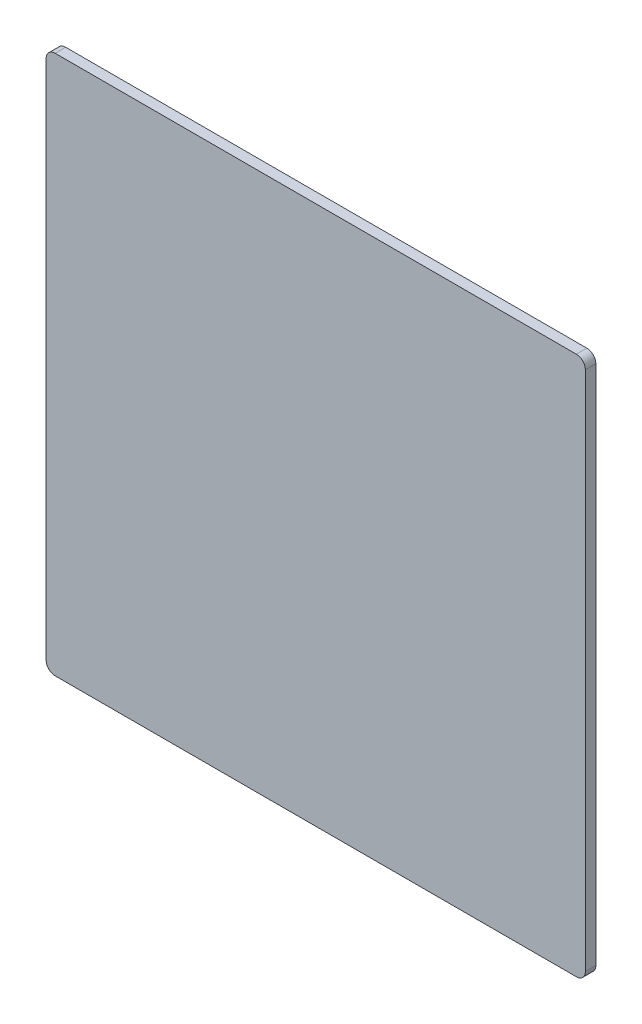
ISO-10303-21;
HEADER;
FILE_DESCRIPTION(('STEP AP214'),'2;1');
FILE_NAME('part.step','',(''),(''),'','','');
FILE_SCHEMA(('AUTOMOTIVE_DESIGN { 1 0 10303 214 1 1 1 1 }'));
ENDSEC;
DATA;
#1=APPLICATION_CONTEXT('core data for automotive mechanical design processes');
#2=APPLICATION_PROTOCOL_DEFINITION('international standard','automotive_design',2000,#1);
#3=PRODUCT_CONTEXT('',#1,'mechanical');
#4=PRODUCT('Part','Part','',(#3));
#5=PRODUCT_RELATED_PRODUCT_CATEGORY('part','',(#4));
#6=PRODUCT_DEFINITION_FORMATION('','',#4);
#7=PRODUCT_DEFINITION_CONTEXT('part definition',#1,'design');
#8=PRODUCT_DEFINITION('design','',#6,#7);
#9=PRODUCT_DEFINITION_SHAPE('','',#8);
#10=(LENGTH_UNIT() NAMED_UNIT(*) SI_UNIT(.MILLI.,.METRE.));
#11=(NAMED_UNIT(*) PLANE_ANGLE_UNIT() SI_UNIT($,.RADIAN.));
#12=(NAMED_UNIT(*) SI_UNIT($,.STERADIAN.) SOLID_ANGLE_UNIT());
#13=UNCERTAINTY_MEASURE_WITH_UNIT(LENGTH_MEASURE(1.E-05),#10,'distance_accuracy_value','');
#14=(GEOMETRIC_REPRESENTATION_CONTEXT(3) GLOBAL_UNCERTAINTY_ASSIGNED_CONTEXT((#13)) GLOBAL_UNIT_ASSIGNED_CONTEXT((#10,
#11,#12)) REPRESENTATION_CONTEXT('',''));
#15=CARTESIAN_POINT('',(0.,0.,0.));
#16=DIRECTION('',(0.,0.,1.));
#17=DIRECTION('',(1.,0.,0.));
#18=AXIS2_PLACEMENT_3D('',#15,#16,#17);
#19=CARTESIAN_POINT('',(65.,-65.,-19.95999956131));
#20=DIRECTION('',(0.,0.,-1.));
#21=DIRECTION('',(0.,-1.,0.));
#22=AXIS2_PLACEMENT_3D('',#19,#20,#21);
#23=PLANE('',#22);
#24=CARTESIAN_POINT('',(65.,-65.,-19.95999956131));
#25=DIRECTION('',(0.,0.,-1.));
#26=DIRECTION('',(1.,0.,0.));
#27=AXIS2_PLACEMENT_3D('',#24,#25,#26);
#28=CIRCLE('',#27,1.5);
#29=CARTESIAN_POINT('',(66.5,-65.,-19.95999956131));
#30=VERTEX_POINT('',#29);
#31=EDGE_CURVE('P0_E9',#30,#30,#28,.T.);
#32=ORIENTED_EDGE('',*,*,#31,.F.);
#33=EDGE_LOOP('',(#32));
#34=FACE_BOUND('',#33,.T.);
#35=ADVANCED_FACE('P0_F14',(#34),#23,.F.);
#36=CARTESIAN_POINT('',(65.,-65.,-20.));
#37=DIRECTION('',(0.,0.,1.));
#38=DIRECTION('',(1.,0.,0.));
#39=AXIS2_PLACEMENT_3D('',#36,#37,#38);
#40=PLANE('',#39);
#41=CARTESIAN_POINT('',(65.,-65.,-20.));
#42=DIRECTION('',(0.,0.,1.));
#43=DIRECTION('',(1.,0.,0.));
#44=AXIS2_PLACEMENT_3D('',#41,#42,#43);
#45=CIRCLE('',#44,1.5);
#46=CARTESIAN_POINT('',(66.5,-65.,-20.));
#47=VERTEX_POINT('',#46);
#48=EDGE_CURVE('P0_E21',#47,#47,#45,.T.);
#49=ORIENTED_EDGE('',*,*,#48,.F.);
#50=EDGE_LOOP('',(#49));
#51=FACE_BOUND('',#50,.T.);
#52=ADVANCED_FACE('P0_F36',(#51),#40,.F.);
#53=CARTESIAN_POINT('',(65.,-65.,-20.));
#54=DIRECTION('',(0.,0.,1.));
#55=DIRECTION('',(1.,0.,0.));
#56=AXIS2_PLACEMENT_3D('',#53,#54,#55);
#57=CYLINDRICAL_SURFACE('',#56,1.5);
#58=ORIENTED_EDGE('',*,*,#31,.T.);
#59=EDGE_LOOP('',(#58));
#60=FACE_BOUND('',#59,.T.);
#61=ORIENTED_EDGE('',*,*,#48,.T.);
#62=EDGE_LOOP('',(#61));
#63=FACE_BOUND('',#62,.T.);
#64=ADVANCED_FACE('P0_F34',(#60,#63),#57,.T.);
#65=CLOSED_SHELL('',(#35,#52,#64));
#66=MANIFOLD_SOLID_BREP('P0_B1',#65);
#67=CARTESIAN_POINT('',(-87.,87.,3.4999999999998));
#68=DIRECTION('',(0.,0.,-1.));
#69=DIRECTION('',(-1.,0.,0.));
#70=AXIS2_PLACEMENT_3D('',#67,#68,#69);
#71=CYLINDRICAL_SURFACE('',#70,3.);
#72=CARTESIAN_POINT('',(-87.,87.,3.50000000000019));
#73=DIRECTION('',(0.,0.,1.));
#74=DIRECTION('',(0.,1.,0.));
#75=AXIS2_PLACEMENT_3D('',#72,#73,#74);
#76=CIRCLE('',#75,3.);
#77=CARTESIAN_POINT('',(-87.,90.,3.5000000000002));
#78=VERTEX_POINT('',#77);
#79=CARTESIAN_POINT('',(-90.,87.,3.50000000000019));
#80=VERTEX_POINT('',#79);
#81=EDGE_CURVE('P1_E110',#78,#80,#76,.T.);
#82=ORIENTED_EDGE('',*,*,#81,.F.);
#83=DIRECTION('',(0.,0.,1.));
#84=VECTOR('',#83,1.);
#85=CARTESIAN_POINT('',(-87.,90.,3.5000000000002));
#86=LINE('',#85,#84);
#87=CARTESIAN_POINT('',(-87.,90.,1.99147411979029E-13));
#88=VERTEX_POINT('',#87);
#89=EDGE_CURVE('P1_E139',#88,#78,#86,.T.);
#90=ORIENTED_EDGE('',*,*,#89,.F.);
#91=CARTESIAN_POINT('',(-87.,87.,1.92554305833426E-13));
#92=DIRECTION('',(0.,0.,-1.));
#93=DIRECTION('',(0.,1.,0.));
#94=AXIS2_PLACEMENT_3D('',#91,#92,#93);
#95=CIRCLE('',#94,3.);
#96=CARTESIAN_POINT('',(-90.,87.,1.92509164913062E-13));
#97=VERTEX_POINT('',#96);
#98=EDGE_CURVE('P1_E180',#97,#88,#95,.T.);
#99=ORIENTED_EDGE('',*,*,#98,.F.);
#100=DIRECTION('',(0.,0.,-1.));
#101=VECTOR('',#100,1.);
#102=CARTESIAN_POINT('',(-90.,87.,3.4999999999998));
#103=LINE('',#102,#101);
#104=EDGE_CURVE('P1_E141',#80,#97,#103,.T.);
#105=ORIENTED_EDGE('',*,*,#104,.F.);
#106=EDGE_LOOP('',(#82,#90,#99,#105));
#107=FACE_BOUND('',#106,.T.);
#108=ADVANCED_FACE('P1_F16',(#107),#71,.T.);
#109=CARTESIAN_POINT('',(87.,87.,3.5000000000002));
#110=DIRECTION('',(0.,0.,-1.));
#111=DIRECTION('',(-1.,0.,0.));
#112=AXIS2_PLACEMENT_3D('',#109,#110,#111);
#113=CYLINDRICAL_SURFACE('',#112,3.);
#114=CARTESIAN_POINT('',(87.,87.,3.50000000000019));
#115=DIRECTION('',(0.,0.,1.));
#116=DIRECTION('',(0.,1.,0.));
#117=AXIS2_PLACEMENT_3D('',#114,#115,#116);
#118=CIRCLE('',#117,3.);
#119=CARTESIAN_POINT('',(90.,87.,3.50000000000019));
#120=VERTEX_POINT('',#119);
#121=CARTESIAN_POINT('',(87.,90.,3.5000000000002));
#122=VERTEX_POINT('',#121);
#123=EDGE_CURVE('P1_E117',#120,#122,#118,.T.);
#124=ORIENTED_EDGE('',*,*,#123,.F.);
#125=DIRECTION('',(0.,0.,1.));
#126=VECTOR('',#125,1.);
#127=CARTESIAN_POINT('',(90.,87.,3.5000000000002));
#128=LINE('',#127,#126);
#129=CARTESIAN_POINT('',(90.,87.,1.92509164913061E-13));
#130=VERTEX_POINT('',#129);
#131=EDGE_CURVE('P1_E162',#130,#120,#128,.T.);
#132=ORIENTED_EDGE('',*,*,#131,.F.);
#133=CARTESIAN_POINT('',(87.,87.,1.92554305833426E-13));
#134=DIRECTION('',(0.,0.,-1.));
#135=DIRECTION('',(0.,1.,0.));
#136=AXIS2_PLACEMENT_3D('',#133,#134,#135);
#137=CIRCLE('',#136,3.);
#138=CARTESIAN_POINT('',(87.,90.,1.99147411979029E-13));
#139=VERTEX_POINT('',#138);
#140=EDGE_CURVE('P1_E25',#139,#130,#137,.T.);
#141=ORIENTED_EDGE('',*,*,#140,.F.);
#142=DIRECTION('',(0.,0.,-1.));
#143=VECTOR('',#142,1.);
#144=CARTESIAN_POINT('',(87.,90.,3.5000000000002));
#145=LINE('',#144,#143);
#146=EDGE_CURVE('P1_E130',#122,#139,#145,.T.);
#147=ORIENTED_EDGE('',*,*,#146,.F.);
#148=EDGE_LOOP('',(#124,#132,#141,#147));
#149=FACE_BOUND('',#148,.T.);
#150=ADVANCED_FACE('P1_F131',(#149),#113,.T.);
#151=CARTESIAN_POINT('',(87.,-87.,3.5000000000002));
#152=DIRECTION('',(0.,0.,-1.));
#153=DIRECTION('',(-1.,0.,0.));
#154=AXIS2_PLACEMENT_3D('',#151,#152,#153);
#155=CYLINDRICAL_SURFACE('',#154,3.);
#156=CARTESIAN_POINT('',(87.,-87.,3.49999999999981));
#157=DIRECTION('',(0.,0.,1.));
#158=DIRECTION('',(0.,1.,0.));
#159=AXIS2_PLACEMENT_3D('',#156,#157,#158);
#160=CIRCLE('',#159,3.);
#161=CARTESIAN_POINT('',(87.,-90.,3.4999999999998));
#162=VERTEX_POINT('',#161);
#163=CARTESIAN_POINT('',(90.,-87.,3.49999999999981));
#164=VERTEX_POINT('',#163);
#165=EDGE_CURVE('P1_E73',#162,#164,#160,.T.);
#166=ORIENTED_EDGE('',*,*,#165,.F.);
#167=DIRECTION('',(0.,0.,1.));
#168=VECTOR('',#167,1.);
#169=CARTESIAN_POINT('',(87.,-90.,3.4999999999998));
#170=LINE('',#169,#168);
#171=CARTESIAN_POINT('',(87.,-90.,-1.99147411979029E-13));
#172=VERTEX_POINT('',#171);
#173=EDGE_CURVE('P1_E179',#172,#162,#170,.T.);
#174=ORIENTED_EDGE('',*,*,#173,.F.);
#175=CARTESIAN_POINT('',(87.,-87.,-1.92554305833426E-13));
#176=DIRECTION('',(0.,0.,-1.));
#177=DIRECTION('',(0.,1.,0.));
#178=AXIS2_PLACEMENT_3D('',#175,#176,#177);
#179=CIRCLE('',#178,3.);
#180=CARTESIAN_POINT('',(90.,-87.,-1.92509164913062E-13));
#181=VERTEX_POINT('',#180);
#182=EDGE_CURVE('P1_E10',#181,#172,#179,.T.);
#183=ORIENTED_EDGE('',*,*,#182,.F.);
#184=DIRECTION('',(0.,0.,-1.));
#185=VECTOR('',#184,1.);
#186=CARTESIAN_POINT('',(90.,-87.,3.5000000000002));
#187=LINE('',#186,#185);
#188=EDGE_CURVE('P1_E158',#164,#181,#187,.T.);
#189=ORIENTED_EDGE('',*,*,#188,.F.);
#190=EDGE_LOOP('',(#166,#174,#183,#189));
#191=FACE_BOUND('',#190,.T.);
#192=ADVANCED_FACE('P1_F200',(#191),#155,.T.);
#193=CARTESIAN_POINT('',(-87.,-87.,3.4999999999998));
#194=DIRECTION('',(0.,0.,-1.));
#195=DIRECTION('',(-1.,0.,0.));
#196=AXIS2_PLACEMENT_3D('',#193,#194,#195);
#197=CYLINDRICAL_SURFACE('',#196,3.);
#198=CARTESIAN_POINT('',(-87.,-87.,3.49999999999981));
#199=DIRECTION('',(0.,0.,1.));
#200=DIRECTION('',(0.,1.,0.));
#201=AXIS2_PLACEMENT_3D('',#198,#199,#200);
#202=CIRCLE('',#201,3.);
#203=CARTESIAN_POINT('',(-90.,-87.,3.49999999999981));
#204=VERTEX_POINT('',#203);
#205=CARTESIAN_POINT('',(-87.,-90.,3.4999999999998));
#206=VERTEX_POINT('',#205);
#207=EDGE_CURVE('P1_E86',#204,#206,#202,.T.);
#208=ORIENTED_EDGE('',*,*,#207,.F.);
#209=DIRECTION('',(0.,0.,1.));
#210=VECTOR('',#209,1.);
#211=CARTESIAN_POINT('',(-90.,-87.,3.4999999999998));
#212=LINE('',#211,#210);
#213=CARTESIAN_POINT('',(-90.,-87.,-1.92509164913061E-13));
#214=VERTEX_POINT('',#213);
#215=EDGE_CURVE('P1_E210',#214,#204,#212,.T.);
#216=ORIENTED_EDGE('',*,*,#215,.F.);
#217=CARTESIAN_POINT('',(-87.,-87.,-1.92554305833426E-13));
#218=DIRECTION('',(0.,0.,-1.));
#219=DIRECTION('',(0.,1.,0.));
#220=AXIS2_PLACEMENT_3D('',#217,#218,#219);
#221=CIRCLE('',#220,3.);
#222=CARTESIAN_POINT('',(-87.,-90.,-1.99147411979029E-13));
#223=VERTEX_POINT('',#222);
#224=EDGE_CURVE('P1_E183',#223,#214,#221,.T.);
#225=ORIENTED_EDGE('',*,*,#224,.F.);
#226=DIRECTION('',(0.,0.,-1.));
#227=VECTOR('',#226,1.);
#228=CARTESIAN_POINT('',(-87.,-90.,3.4999999999998));
#229=LINE('',#228,#227);
#230=EDGE_CURVE('P1_E172',#206,#223,#229,.T.);
#231=ORIENTED_EDGE('',*,*,#230,.F.);
#232=EDGE_LOOP('',(#208,#216,#225,#231));
#233=FACE_BOUND('',#232,.T.);
#234=ADVANCED_FACE('P1_F211',(#233),#197,.T.);
#235=CARTESIAN_POINT('',(-65.,-65.,-20.));
#236=DIRECTION('',(0.,0.,1.));
#237=DIRECTION('',(1.,0.,0.));
#238=AXIS2_PLACEMENT_3D('',#235,#236,#237);
#239=PLANE('',#238);
#240=CARTESIAN_POINT('',(-65.,-65.,-20.));
#241=DIRECTION('',(0.,0.,1.));
#242=DIRECTION('',(1.,0.,0.));
#243=AXIS2_PLACEMENT_3D('',#240,#241,#242);
#244=CIRCLE('',#243,1.5);
#245=CARTESIAN_POINT('',(-63.5,-65.,-20.));
#246=VERTEX_POINT('',#245);
#247=EDGE_CURVE('P1_E424',#246,#246,#244,.T.);
#248=ORIENTED_EDGE('',*,*,#247,.F.);
#249=EDGE_LOOP('',(#248));
#250=FACE_BOUND('',#249,.T.);
#251=ADVANCED_FACE('P1_F253',(#250),#239,.F.);
#252=CARTESIAN_POINT('',(-65.,65.,-20.));
#253=DIRECTION('',(0.,0.,1.));
#254=DIRECTION('',(1.,0.,0.));
#255=AXIS2_PLACEMENT_3D('',#252,#253,#254);
#256=PLANE('',#255);
#257=CARTESIAN_POINT('',(-65.,65.,-20.));
#258=DIRECTION('',(0.,0.,1.));
#259=DIRECTION('',(1.,0.,0.));
#260=AXIS2_PLACEMENT_3D('',#257,#258,#259);
#261=CIRCLE('',#260,1.5);
#262=CARTESIAN_POINT('',(-63.5,65.,-20.));
#263=VERTEX_POINT('',#262);
#264=EDGE_CURVE('P1_E409',#263,#263,#261,.T.);
#265=ORIENTED_EDGE('',*,*,#264,.F.);
#266=EDGE_LOOP('',(#265));
#267=FACE_BOUND('',#266,.T.);
#268=ADVANCED_FACE('P1_F251',(#267),#256,.F.);
#269=CARTESIAN_POINT('',(65.,65.,-20.));
#270=DIRECTION('',(0.,0.,1.));
#271=DIRECTION('',(1.,0.,0.));
#272=AXIS2_PLACEMENT_3D('',#269,#270,#271);
#273=PLANE('',#272);
#274=CARTESIAN_POINT('',(65.,65.,-20.));
#275=DIRECTION('',(0.,0.,1.));
#276=DIRECTION('',(1.,0.,0.));
#277=AXIS2_PLACEMENT_3D('',#274,#275,#276);
#278=CIRCLE('',#277,1.5);
#279=CARTESIAN_POINT('',(66.5,65.,-20.));
#280=VERTEX_POINT('',#279);
#281=EDGE_CURVE('P1_E229',#280,#280,#278,.T.);
#282=ORIENTED_EDGE('',*,*,#281,.F.);
#283=EDGE_LOOP('',(#282));
#284=FACE_BOUND('',#283,.T.);
#285=ADVANCED_FACE('P1_F277',(#284),#273,.F.);
#286=CARTESIAN_POINT('',(0.,0.,0.));
#287=DIRECTION('',(0.,0.,-1.));
#288=DIRECTION('',(-1.,0.,0.));
#289=AXIS2_PLACEMENT_3D('',#286,#287,#288);
#290=PLANE('',#289);
#291=CARTESIAN_POINT('',(-65.,-65.,-1.42247325030098E-13));
#292=DIRECTION('',(0.,0.,-1.));
#293=DIRECTION('',(0.,1.,0.));
#294=AXIS2_PLACEMENT_3D('',#291,#292,#293);
#295=CIRCLE('',#294,1.5);
#296=CARTESIAN_POINT('',(-65.,-63.5,-1.38928201497114E-13));
#297=VERTEX_POINT('',#296);
#298=EDGE_CURVE('P1_E416',#297,#297,#295,.T.);
#299=ORIENTED_EDGE('',*,*,#298,.F.);
#300=EDGE_LOOP('',(#299));
#301=FACE_BOUND('',#300,.T.);
#302=CARTESIAN_POINT('',(-65.,65.,1.42247325030098E-13));
#303=DIRECTION('',(0.,0.,-1.));
#304=DIRECTION('',(0.,1.,0.));
#305=AXIS2_PLACEMENT_3D('',#302,#303,#304);
#306=CIRCLE('',#305,1.5);
#307=CARTESIAN_POINT('',(-65.,66.5,1.45566448563082E-13));
#308=VERTEX_POINT('',#307);
#309=EDGE_CURVE('P1_E234',#308,#308,#306,.T.);
#310=ORIENTED_EDGE('',*,*,#309,.F.);
#311=EDGE_LOOP('',(#310));
#312=FACE_BOUND('',#311,.T.);
#313=CARTESIAN_POINT('',(65.,-65.,-1.42247325030098E-13));
#314=DIRECTION('',(0.,0.,-1.));
#315=DIRECTION('',(0.,1.,0.));
#316=AXIS2_PLACEMENT_3D('',#313,#314,#315);
#317=CIRCLE('',#316,1.5);
#318=CARTESIAN_POINT('',(65.,-63.5,-1.38928201497114E-13));
#319=VERTEX_POINT('',#318);
#320=EDGE_CURVE('P1_E218',#319,#319,#317,.T.);
#321=ORIENTED_EDGE('',*,*,#320,.F.);
#322=EDGE_LOOP('',(#321));
#323=FACE_BOUND('',#322,.T.);
#324=CARTESIAN_POINT('',(65.,65.,0.));
#325=DIRECTION('',(0.,0.,1.));
#326=DIRECTION('',(1.,0.,0.));
#327=AXIS2_PLACEMENT_3D('',#324,#325,#326);
#328=CIRCLE('',#327,1.5);
#329=CARTESIAN_POINT('',(66.5,65.,0.));
#330=VERTEX_POINT('',#329);
#331=EDGE_CURVE('P1_E233',#330,#330,#328,.T.);
#332=ORIENTED_EDGE('',*,*,#331,.T.);
#333=EDGE_LOOP('',(#332));
#334=FACE_BOUND('',#333,.T.);
#335=DIRECTION('',(-1.,0.,0.));
#336=VECTOR('',#335,1.);
#337=CARTESIAN_POINT('',(90.,-90.,-1.99147411979029E-13));
#338=LINE('',#337,#336);
#339=EDGE_CURVE('P1_E176',#172,#223,#338,.T.);
#340=ORIENTED_EDGE('',*,*,#339,.T.);
#341=ORIENTED_EDGE('',*,*,#224,.T.);
#342=DIRECTION('',(0.,1.,0.));
#343=VECTOR('',#342,1.);
#344=CARTESIAN_POINT('',(-90.,-90.,-1.99147411979029E-13));
#345=LINE('',#344,#343);
#346=EDGE_CURVE('P1_E207',#214,#97,#345,.T.);
#347=ORIENTED_EDGE('',*,*,#346,.T.);
#348=ORIENTED_EDGE('',*,*,#98,.T.);
#349=DIRECTION('',(1.,0.,0.));
#350=VECTOR('',#349,1.);
#351=CARTESIAN_POINT('',(-90.,90.,1.99147411979029E-13));
#352=LINE('',#351,#350);
#353=EDGE_CURVE('P1_E136',#88,#139,#352,.T.);
#354=ORIENTED_EDGE('',*,*,#353,.T.);
#355=ORIENTED_EDGE('',*,*,#140,.T.);
#356=DIRECTION('',(0.,-1.,0.));
#357=VECTOR('',#356,1.);
#358=CARTESIAN_POINT('',(90.,90.,1.99147411979029E-13));
#359=LINE('',#358,#357);
#360=EDGE_CURVE('P1_E159',#130,#181,#359,.T.);
#361=ORIENTED_EDGE('',*,*,#360,.T.);
#362=ORIENTED_EDGE('',*,*,#182,.T.);
#363=EDGE_LOOP('',(#340,#341,#347,#348,#354,#355,#361,#362));
#364=FACE_BOUND('',#363,.T.);
#365=ADVANCED_FACE('P1_F196',(#301,#312,#323,#334,#364),#290,.T.);
#366=CARTESIAN_POINT('',(0.,0.,3.5));
#367=DIRECTION('',(0.,0.,-1.));
#368=DIRECTION('',(-1.,0.,0.));
#369=AXIS2_PLACEMENT_3D('',#366,#367,#368);
#370=PLANE('',#369);
#371=DIRECTION('',(0.,1.,0.));
#372=VECTOR('',#371,1.);
#373=CARTESIAN_POINT('',(-90.,-90.,3.4999999999998));
#374=LINE('',#373,#372);
#375=EDGE_CURVE('P1_E148',#204,#80,#374,.T.);
#376=ORIENTED_EDGE('',*,*,#375,.F.);
#377=ORIENTED_EDGE('',*,*,#207,.T.);
#378=DIRECTION('',(-1.,0.,0.));
#379=VECTOR('',#378,1.);
#380=CARTESIAN_POINT('',(90.,-90.,3.4999999999998));
#381=LINE('',#380,#379);
#382=EDGE_CURVE('P1_E168',#162,#206,#381,.T.);
#383=ORIENTED_EDGE('',*,*,#382,.F.);
#384=ORIENTED_EDGE('',*,*,#165,.T.);
#385=DIRECTION('',(0.,-1.,0.));
#386=VECTOR('',#385,1.);
#387=CARTESIAN_POINT('',(90.,90.,3.5000000000002));
#388=LINE('',#387,#386);
#389=EDGE_CURVE('P1_E123',#120,#164,#388,.T.);
#390=ORIENTED_EDGE('',*,*,#389,.F.);
#391=ORIENTED_EDGE('',*,*,#123,.T.);
#392=DIRECTION('',(1.,0.,0.));
#393=VECTOR('',#392,1.);
#394=CARTESIAN_POINT('',(-90.,90.,3.5000000000002));
#395=LINE('',#394,#393);
#396=EDGE_CURVE('P1_E121',#78,#122,#395,.T.);
#397=ORIENTED_EDGE('',*,*,#396,.F.);
#398=ORIENTED_EDGE('',*,*,#81,.T.);
#399=EDGE_LOOP('',(#376,#377,#383,#384,#390,#391,#397,#398));
#400=FACE_BOUND('',#399,.T.);
#401=ADVANCED_FACE('P1_F119',(#400),#370,.F.);
#402=CARTESIAN_POINT('',(90.,-90.,3.4999999999998));
#403=DIRECTION('',(0.,-1.,0.));
#404=DIRECTION('',(0.,0.,-1.));
#405=AXIS2_PLACEMENT_3D('',#402,#403,#404);
#406=PLANE('',#405);
#407=ORIENTED_EDGE('',*,*,#382,.T.);
#408=ORIENTED_EDGE('',*,*,#230,.T.);
#409=ORIENTED_EDGE('',*,*,#339,.F.);
#410=ORIENTED_EDGE('',*,*,#173,.T.);
#411=EDGE_LOOP('',(#407,#408,#409,#410));
#412=FACE_BOUND('',#411,.T.);
#413=ADVANCED_FACE('P1_F203',(#412),#406,.T.);
#414=CARTESIAN_POINT('',(90.,90.,3.5000000000002));
#415=DIRECTION('',(1.,0.,0.));
#416=DIRECTION('',(0.,1.,0.));
#417=AXIS2_PLACEMENT_3D('',#414,#415,#416);
#418=PLANE('',#417);
#419=ORIENTED_EDGE('',*,*,#389,.T.);
#420=ORIENTED_EDGE('',*,*,#188,.T.);
#421=ORIENTED_EDGE('',*,*,#360,.F.);
#422=ORIENTED_EDGE('',*,*,#131,.T.);
#423=EDGE_LOOP('',(#419,#420,#421,#422));
#424=FACE_BOUND('',#423,.T.);
#425=ADVANCED_FACE('P1_F199',(#424),#418,.T.);
#426=CARTESIAN_POINT('',(-90.,90.,3.5000000000002));
#427=DIRECTION('',(0.,1.,0.));
#428=DIRECTION('',(1.,0.,0.));
#429=AXIS2_PLACEMENT_3D('',#426,#427,#428);
#430=PLANE('',#429);
#431=ORIENTED_EDGE('',*,*,#396,.T.);
#432=ORIENTED_EDGE('',*,*,#146,.T.);
#433=ORIENTED_EDGE('',*,*,#353,.F.);
#434=ORIENTED_EDGE('',*,*,#89,.T.);
#435=EDGE_LOOP('',(#431,#432,#433,#434));
#436=FACE_BOUND('',#435,.T.);
#437=ADVANCED_FACE('P1_F138',(#436),#430,.T.);
#438=CARTESIAN_POINT('',(-90.,-90.,3.4999999999998));
#439=DIRECTION('',(-1.,0.,0.));
#440=DIRECTION('',(0.,0.,1.));
#441=AXIS2_PLACEMENT_3D('',#438,#439,#440);
#442=PLANE('',#441);
#443=ORIENTED_EDGE('',*,*,#346,.F.);
#444=ORIENTED_EDGE('',*,*,#215,.T.);
#445=ORIENTED_EDGE('',*,*,#375,.T.);
#446=ORIENTED_EDGE('',*,*,#104,.T.);
#447=EDGE_LOOP('',(#443,#444,#445,#446));
#448=FACE_BOUND('',#447,.T.);
#449=ADVANCED_FACE('P1_F216',(#448),#442,.T.);
#450=CARTESIAN_POINT('',(65.,-65.,-17.95999956131));
#451=DIRECTION('',(0.,0.,-1.));
#452=DIRECTION('',(0.,-1.,0.));
#453=AXIS2_PLACEMENT_3D('',#450,#451,#452);
#454=PLANE('',#453);
#455=CARTESIAN_POINT('',(65.,-65.,-17.95999956131));
#456=DIRECTION('',(0.,0.,1.));
#457=DIRECTION('',(1.,0.,0.));
#458=AXIS2_PLACEMENT_3D('',#455,#456,#457);
#459=CIRCLE('',#458,1.5);
#460=CARTESIAN_POINT('',(66.5,-65.,-17.95999956131));
#461=VERTEX_POINT('',#460);
#462=EDGE_CURVE('P1_E225',#461,#461,#459,.T.);
#463=ORIENTED_EDGE('',*,*,#462,.F.);
#464=EDGE_LOOP('',(#463));
#465=FACE_BOUND('',#464,.T.);
#466=ADVANCED_FACE('P1_F328',(#465),#454,.T.);
#467=CARTESIAN_POINT('',(65.,-65.,-20.));
#468=DIRECTION('',(0.,0.,1.));
#469=DIRECTION('',(1.,0.,0.));
#470=AXIS2_PLACEMENT_3D('',#467,#468,#469);
#471=CYLINDRICAL_SURFACE('',#470,1.5);
#472=ORIENTED_EDGE('',*,*,#320,.T.);
#473=EDGE_LOOP('',(#472));
#474=FACE_BOUND('',#473,.T.);
#475=ORIENTED_EDGE('',*,*,#462,.T.);
#476=EDGE_LOOP('',(#475));
#477=FACE_BOUND('',#476,.T.);
#478=ADVANCED_FACE('P1_F336',(#474,#477),#471,.T.);
#479=CARTESIAN_POINT('',(65.,65.,-20.));
#480=DIRECTION('',(0.,0.,1.));
#481=DIRECTION('',(1.,0.,0.));
#482=AXIS2_PLACEMENT_3D('',#479,#480,#481);
#483=CYLINDRICAL_SURFACE('',#482,1.5);
#484=ORIENTED_EDGE('',*,*,#331,.F.);
#485=EDGE_LOOP('',(#484));
#486=FACE_BOUND('',#485,.T.);
#487=ORIENTED_EDGE('',*,*,#281,.T.);
#488=EDGE_LOOP('',(#487));
#489=FACE_BOUND('',#488,.T.);
#490=ADVANCED_FACE('P1_F345',(#486,#489),#483,.T.);
#491=CARTESIAN_POINT('',(-65.,65.,-20.));
#492=DIRECTION('',(0.,0.,1.));
#493=DIRECTION('',(1.,0.,0.));
#494=AXIS2_PLACEMENT_3D('',#491,#492,#493);
#495=CYLINDRICAL_SURFACE('',#494,1.5);
#496=ORIENTED_EDGE('',*,*,#309,.T.);
#497=EDGE_LOOP('',(#496));
#498=FACE_BOUND('',#497,.T.);
#499=ORIENTED_EDGE('',*,*,#264,.T.);
#500=EDGE_LOOP('',(#499));
#501=FACE_BOUND('',#500,.T.);
#502=ADVANCED_FACE('P1_F354',(#498,#501),#495,.T.);
#503=CARTESIAN_POINT('',(-65.,-65.,-20.));
#504=DIRECTION('',(0.,0.,1.));
#505=DIRECTION('',(1.,0.,0.));
#506=AXIS2_PLACEMENT_3D('',#503,#504,#505);
#507=CYLINDRICAL_SURFACE('',#506,1.5);
#508=ORIENTED_EDGE('',*,*,#298,.T.);
#509=EDGE_LOOP('',(#508));
#510=FACE_BOUND('',#509,.T.);
#511=ORIENTED_EDGE('',*,*,#247,.T.);
#512=EDGE_LOOP('',(#511));
#513=FACE_BOUND('',#512,.T.);
#514=ADVANCED_FACE('P1_F363',(#510,#513),#507,.T.);
#515=CLOSED_SHELL('',(#108,#150,#192,#234,#251,#268,#285,#365,#401,#413,#425,#437,#449,#466,
#478,#490,#502,#514));
#516=MANIFOLD_SOLID_BREP('P1_B1',#515);
#517=ADVANCED_BREP_SHAPE_REPRESENTATION('',(#18,#66,#516),#14);
#518=SHAPE_DEFINITION_REPRESENTATION(#9,#517);
ENDSEC;
END-ISO-10303-21;
